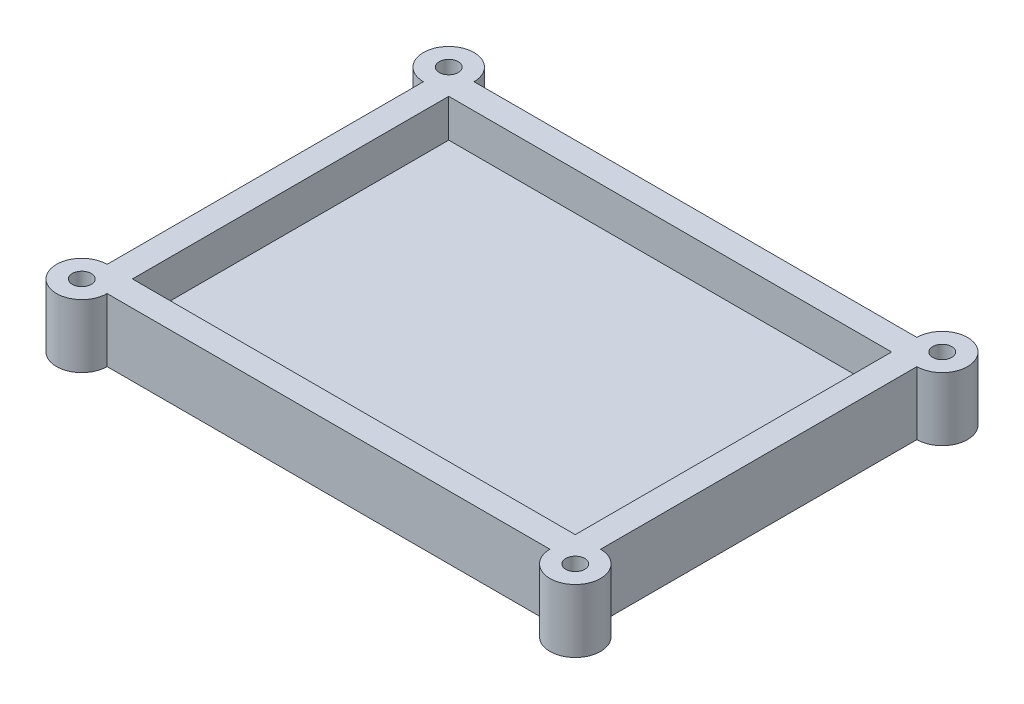
ISO-10303-21;
HEADER;
FILE_DESCRIPTION(('STEP AP214'),'2;1');
FILE_NAME('part.step','',(''),(''),'','','');
FILE_SCHEMA(('AUTOMOTIVE_DESIGN { 1 0 10303 214 1 1 1 1 }'));
ENDSEC;
DATA;
#1=APPLICATION_CONTEXT('core data for automotive mechanical design processes');
#2=APPLICATION_PROTOCOL_DEFINITION('international standard','automotive_design',2000,#1);
#3=PRODUCT_CONTEXT('',#1,'mechanical');
#4=PRODUCT('Part','Part','',(#3));
#5=PRODUCT_RELATED_PRODUCT_CATEGORY('part','',(#4));
#6=PRODUCT_DEFINITION_FORMATION('','',#4);
#7=PRODUCT_DEFINITION_CONTEXT('part definition',#1,'design');
#8=PRODUCT_DEFINITION('design','',#6,#7);
#9=PRODUCT_DEFINITION_SHAPE('','',#8);
#10=(LENGTH_UNIT() NAMED_UNIT(*) SI_UNIT(.MILLI.,.METRE.));
#11=(NAMED_UNIT(*) PLANE_ANGLE_UNIT() SI_UNIT($,.RADIAN.));
#12=(NAMED_UNIT(*) SI_UNIT($,.STERADIAN.) SOLID_ANGLE_UNIT());
#13=UNCERTAINTY_MEASURE_WITH_UNIT(LENGTH_MEASURE(1.E-05),#10,'distance_accuracy_value','');
#14=(GEOMETRIC_REPRESENTATION_CONTEXT(3) GLOBAL_UNCERTAINTY_ASSIGNED_CONTEXT((#13)) GLOBAL_UNIT_ASSIGNED_CONTEXT((#10,
#11,#12)) REPRESENTATION_CONTEXT('',''));
#15=CARTESIAN_POINT('',(0.,0.,0.));
#16=DIRECTION('',(0.,0.,1.));
#17=DIRECTION('',(1.,0.,0.));
#18=AXIS2_PLACEMENT_3D('',#15,#16,#17);
#19=CARTESIAN_POINT('',(195.,50.,-145.));
#20=DIRECTION('',(-1.,0.,0.));
#21=DIRECTION('',(0.,0.,1.));
#22=AXIS2_PLACEMENT_3D('',#19,#20,#21);
#23=PLANE('',#22);
#24=DIRECTION('',(0.,0.,-1.));
#25=VECTOR('',#24,1.);
#26=CARTESIAN_POINT('',(195.,50.,-145.));
#27=LINE('',#26,#25);
#28=CARTESIAN_POINT('',(195.,50.,125.));
#29=VERTEX_POINT('',#28);
#30=CARTESIAN_POINT('',(195.,50.,-125.));
#31=VERTEX_POINT('',#30);
#32=EDGE_CURVE('E234',#29,#31,#27,.T.);
#33=ORIENTED_EDGE('',*,*,#32,.F.);
#34=DIRECTION('',(0.,1.,0.));
#35=VECTOR('',#34,1.);
#36=CARTESIAN_POINT('',(195.,0.,125.));
#37=LINE('',#36,#35);
#38=CARTESIAN_POINT('',(195.,0.,125.));
#39=VERTEX_POINT('',#38);
#40=EDGE_CURVE('E181',#29,#39,#37,.F.);
#41=ORIENTED_EDGE('',*,*,#40,.T.);
#42=DIRECTION('',(0.,0.,-1.));
#43=VECTOR('',#42,1.);
#44=CARTESIAN_POINT('',(195.,0.,-145.));
#45=LINE('',#44,#43);
#46=CARTESIAN_POINT('',(195.,0.,-125.));
#47=VERTEX_POINT('',#46);
#48=EDGE_CURVE('E210',#39,#47,#45,.T.);
#49=ORIENTED_EDGE('',*,*,#48,.T.);
#50=DIRECTION('',(0.,1.,0.));
#51=VECTOR('',#50,1.);
#52=CARTESIAN_POINT('',(195.,0.,-125.));
#53=LINE('',#52,#51);
#54=EDGE_CURVE('E190',#47,#31,#53,.T.);
#55=ORIENTED_EDGE('',*,*,#54,.T.);
#56=EDGE_LOOP('',(#33,#41,#49,#55));
#57=FACE_BOUND('',#56,.T.);
#58=ADVANCED_FACE('F33',(#57),#23,.F.);
#59=CARTESIAN_POINT('',(-195.,50.,-145.));
#60=DIRECTION('',(0.,0.,1.));
#61=DIRECTION('',(1.,0.,0.));
#62=AXIS2_PLACEMENT_3D('',#59,#60,#61);
#63=PLANE('',#62);
#64=DIRECTION('',(-1.,0.,0.));
#65=VECTOR('',#64,1.);
#66=CARTESIAN_POINT('',(-195.,50.,-145.));
#67=LINE('',#66,#65);
#68=CARTESIAN_POINT('',(175.,50.,-145.));
#69=VERTEX_POINT('',#68);
#70=CARTESIAN_POINT('',(-175.,50.,-145.));
#71=VERTEX_POINT('',#70);
#72=EDGE_CURVE('E236',#69,#71,#67,.T.);
#73=ORIENTED_EDGE('',*,*,#72,.F.);
#74=DIRECTION('',(0.,1.,0.));
#75=VECTOR('',#74,1.);
#76=CARTESIAN_POINT('',(175.,0.,-145.));
#77=LINE('',#76,#75);
#78=CARTESIAN_POINT('',(175.,0.,-145.));
#79=VERTEX_POINT('',#78);
#80=EDGE_CURVE('E186',#69,#79,#77,.F.);
#81=ORIENTED_EDGE('',*,*,#80,.T.);
#82=DIRECTION('',(-1.,0.,0.));
#83=VECTOR('',#82,1.);
#84=CARTESIAN_POINT('',(-195.,0.,-145.));
#85=LINE('',#84,#83);
#86=CARTESIAN_POINT('',(-175.,0.,-145.));
#87=VERTEX_POINT('',#86);
#88=EDGE_CURVE('E240',#79,#87,#85,.T.);
#89=ORIENTED_EDGE('',*,*,#88,.T.);
#90=DIRECTION('',(0.,1.,0.));
#91=VECTOR('',#90,1.);
#92=CARTESIAN_POINT('',(-175.,0.,-145.));
#93=LINE('',#92,#91);
#94=EDGE_CURVE('E200',#87,#71,#93,.T.);
#95=ORIENTED_EDGE('',*,*,#94,.T.);
#96=EDGE_LOOP('',(#73,#81,#89,#95));
#97=FACE_BOUND('',#96,.T.);
#98=ADVANCED_FACE('F267',(#97),#63,.F.);
#99=CARTESIAN_POINT('',(-195.,50.,-145.));
#100=DIRECTION('',(1.,0.,0.));
#101=DIRECTION('',(0.,0.,-1.));
#102=AXIS2_PLACEMENT_3D('',#99,#100,#101);
#103=PLANE('',#102);
#104=DIRECTION('',(0.,0.,1.));
#105=VECTOR('',#104,1.);
#106=CARTESIAN_POINT('',(-195.,0.,-145.));
#107=LINE('',#106,#105);
#108=CARTESIAN_POINT('',(-195.,0.,-125.));
#109=VERTEX_POINT('',#108);
#110=CARTESIAN_POINT('',(-195.,0.,125.));
#111=VERTEX_POINT('',#110);
#112=EDGE_CURVE('E241',#109,#111,#107,.T.);
#113=ORIENTED_EDGE('',*,*,#112,.T.);
#114=DIRECTION('',(0.,1.,0.));
#115=VECTOR('',#114,1.);
#116=CARTESIAN_POINT('',(-195.,0.,125.));
#117=LINE('',#116,#115);
#118=CARTESIAN_POINT('',(-195.,50.,125.));
#119=VERTEX_POINT('',#118);
#120=EDGE_CURVE('E170',#111,#119,#117,.T.);
#121=ORIENTED_EDGE('',*,*,#120,.T.);
#122=DIRECTION('',(0.,0.,1.));
#123=VECTOR('',#122,1.);
#124=CARTESIAN_POINT('',(-195.,50.,-145.));
#125=LINE('',#124,#123);
#126=CARTESIAN_POINT('',(-195.,50.,-125.));
#127=VERTEX_POINT('',#126);
#128=EDGE_CURVE('E41',#127,#119,#125,.T.);
#129=ORIENTED_EDGE('',*,*,#128,.F.);
#130=DIRECTION('',(0.,1.,0.));
#131=VECTOR('',#130,1.);
#132=CARTESIAN_POINT('',(-195.,0.,-125.));
#133=LINE('',#132,#131);
#134=EDGE_CURVE('E196',#127,#109,#133,.F.);
#135=ORIENTED_EDGE('',*,*,#134,.T.);
#136=EDGE_LOOP('',(#113,#121,#129,#135));
#137=FACE_BOUND('',#136,.T.);
#138=ADVANCED_FACE('F277',(#137),#103,.F.);
#139=CARTESIAN_POINT('',(-195.,50.,145.));
#140=DIRECTION('',(0.,0.,-1.));
#141=DIRECTION('',(-1.,0.,0.));
#142=AXIS2_PLACEMENT_3D('',#139,#140,#141);
#143=PLANE('',#142);
#144=DIRECTION('',(1.,0.,0.));
#145=VECTOR('',#144,1.);
#146=CARTESIAN_POINT('',(-195.,50.,145.));
#147=LINE('',#146,#145);
#148=CARTESIAN_POINT('',(-175.,50.,145.));
#149=VERTEX_POINT('',#148);
#150=CARTESIAN_POINT('',(175.,50.,145.));
#151=VERTEX_POINT('',#150);
#152=EDGE_CURVE('E11',#149,#151,#147,.T.);
#153=ORIENTED_EDGE('',*,*,#152,.F.);
#154=DIRECTION('',(0.,1.,0.));
#155=VECTOR('',#154,1.);
#156=CARTESIAN_POINT('',(-175.,0.,145.));
#157=LINE('',#156,#155);
#158=CARTESIAN_POINT('',(-175.,0.,145.));
#159=VERTEX_POINT('',#158);
#160=EDGE_CURVE('E166',#149,#159,#157,.F.);
#161=ORIENTED_EDGE('',*,*,#160,.T.);
#162=DIRECTION('',(1.,0.,0.));
#163=VECTOR('',#162,1.);
#164=CARTESIAN_POINT('',(-195.,0.,145.));
#165=LINE('',#164,#163);
#166=CARTESIAN_POINT('',(175.,0.,145.));
#167=VERTEX_POINT('',#166);
#168=EDGE_CURVE('E36',#159,#167,#165,.T.);
#169=ORIENTED_EDGE('',*,*,#168,.T.);
#170=DIRECTION('',(0.,1.,0.));
#171=VECTOR('',#170,1.);
#172=CARTESIAN_POINT('',(175.,0.,145.));
#173=LINE('',#172,#171);
#174=EDGE_CURVE('E176',#167,#151,#173,.T.);
#175=ORIENTED_EDGE('',*,*,#174,.T.);
#176=EDGE_LOOP('',(#153,#161,#169,#175));
#177=FACE_BOUND('',#176,.T.);
#178=ADVANCED_FACE('F249',(#177),#143,.F.);
#179=CARTESIAN_POINT('',(0.,50.,0.));
#180=DIRECTION('',(0.,1.,0.));
#181=DIRECTION('',(0.,0.,1.));
#182=AXIS2_PLACEMENT_3D('',#179,#180,#181);
#183=PLANE('',#182);
#184=CARTESIAN_POINT('',(-195.,50.,-145.));
#185=DIRECTION('',(0.,1.,0.));
#186=DIRECTION('',(0.,0.,1.));
#187=AXIS2_PLACEMENT_3D('',#184,#185,#186);
#188=CIRCLE('',#187,7.49999999999998);
#189=CARTESIAN_POINT('',(-195.,50.,-137.5));
#190=VERTEX_POINT('',#189);
#191=EDGE_CURVE('E142',#190,#190,#188,.T.);
#192=ORIENTED_EDGE('',*,*,#191,.F.);
#193=EDGE_LOOP('',(#192));
#194=FACE_BOUND('',#193,.T.);
#195=CARTESIAN_POINT('',(195.,50.,-145.));
#196=DIRECTION('',(0.,1.,0.));
#197=DIRECTION('',(0.,0.,1.));
#198=AXIS2_PLACEMENT_3D('',#195,#196,#197);
#199=CIRCLE('',#198,7.49999999999998);
#200=CARTESIAN_POINT('',(195.,50.,-137.5));
#201=VERTEX_POINT('',#200);
#202=EDGE_CURVE('E141',#201,#201,#199,.T.);
#203=ORIENTED_EDGE('',*,*,#202,.F.);
#204=EDGE_LOOP('',(#203));
#205=FACE_BOUND('',#204,.T.);
#206=CARTESIAN_POINT('',(195.,50.,145.));
#207=DIRECTION('',(0.,1.,0.));
#208=DIRECTION('',(0.,0.,1.));
#209=AXIS2_PLACEMENT_3D('',#206,#207,#208);
#210=CIRCLE('',#209,7.49999999999998);
#211=CARTESIAN_POINT('',(195.,50.,152.5));
#212=VERTEX_POINT('',#211);
#213=EDGE_CURVE('E152',#212,#212,#210,.T.);
#214=ORIENTED_EDGE('',*,*,#213,.F.);
#215=EDGE_LOOP('',(#214));
#216=FACE_BOUND('',#215,.T.);
#217=CARTESIAN_POINT('',(-195.,50.,145.));
#218=DIRECTION('',(0.,1.,0.));
#219=DIRECTION('',(0.,0.,1.));
#220=AXIS2_PLACEMENT_3D('',#217,#218,#219);
#221=CIRCLE('',#220,7.49999999999998);
#222=CARTESIAN_POINT('',(-195.,50.,152.5));
#223=VERTEX_POINT('',#222);
#224=EDGE_CURVE('E158',#223,#223,#221,.T.);
#225=ORIENTED_EDGE('',*,*,#224,.F.);
#226=EDGE_LOOP('',(#225));
#227=FACE_BOUND('',#226,.T.);
#228=ORIENTED_EDGE('',*,*,#128,.T.);
#229=CARTESIAN_POINT('',(-195.,50.,145.));
#230=DIRECTION('',(0.,1.,0.));
#231=DIRECTION('',(0.,0.,-1.));
#232=AXIS2_PLACEMENT_3D('',#229,#230,#231);
#233=CIRCLE('',#232,20.);
#234=EDGE_CURVE('E48',#119,#149,#233,.T.);
#235=ORIENTED_EDGE('',*,*,#234,.T.);
#236=ORIENTED_EDGE('',*,*,#152,.T.);
#237=CARTESIAN_POINT('',(195.,50.,145.));
#238=DIRECTION('',(0.,1.,0.));
#239=DIRECTION('',(0.,0.,1.));
#240=AXIS2_PLACEMENT_3D('',#237,#238,#239);
#241=CIRCLE('',#240,20.);
#242=EDGE_CURVE('E173',#151,#29,#241,.T.);
#243=ORIENTED_EDGE('',*,*,#242,.T.);
#244=ORIENTED_EDGE('',*,*,#32,.T.);
#245=CARTESIAN_POINT('',(195.,50.,-145.));
#246=DIRECTION('',(0.,1.,0.));
#247=DIRECTION('',(0.,0.,-1.));
#248=AXIS2_PLACEMENT_3D('',#245,#246,#247);
#249=CIRCLE('',#248,20.);
#250=EDGE_CURVE('E55',#31,#69,#249,.T.);
#251=ORIENTED_EDGE('',*,*,#250,.T.);
#252=ORIENTED_EDGE('',*,*,#72,.T.);
#253=CARTESIAN_POINT('',(-195.,50.,-145.));
#254=DIRECTION('',(0.,1.,0.));
#255=DIRECTION('',(0.,0.,1.));
#256=AXIS2_PLACEMENT_3D('',#253,#254,#255);
#257=CIRCLE('',#256,20.);
#258=EDGE_CURVE('E193',#71,#127,#257,.T.);
#259=ORIENTED_EDGE('',*,*,#258,.T.);
#260=EDGE_LOOP('',(#228,#235,#236,#243,#244,#251,#252,#259));
#261=FACE_BOUND('',#260,.T.);
#262=DIRECTION('',(0.,0.,-1.));
#263=VECTOR('',#262,1.);
#264=CARTESIAN_POINT('',(175.,50.,-145.));
#265=LINE('',#264,#263);
#266=CARTESIAN_POINT('',(175.,50.,125.));
#267=VERTEX_POINT('',#266);
#268=CARTESIAN_POINT('',(175.,50.,-125.));
#269=VERTEX_POINT('',#268);
#270=EDGE_CURVE('E226',#267,#269,#265,.T.);
#271=ORIENTED_EDGE('',*,*,#270,.F.);
#272=DIRECTION('',(1.,0.,0.));
#273=VECTOR('',#272,1.);
#274=CARTESIAN_POINT('',(-195.,50.,125.));
#275=LINE('',#274,#273);
#276=CARTESIAN_POINT('',(-175.,50.,125.));
#277=VERTEX_POINT('',#276);
#278=EDGE_CURVE('E216',#277,#267,#275,.T.);
#279=ORIENTED_EDGE('',*,*,#278,.F.);
#280=DIRECTION('',(0.,0.,1.));
#281=VECTOR('',#280,1.);
#282=CARTESIAN_POINT('',(-175.,50.,-145.));
#283=LINE('',#282,#281);
#284=CARTESIAN_POINT('',(-175.,50.,-125.));
#285=VERTEX_POINT('',#284);
#286=EDGE_CURVE('E230',#285,#277,#283,.T.);
#287=ORIENTED_EDGE('',*,*,#286,.F.);
#288=DIRECTION('',(-1.,0.,0.));
#289=VECTOR('',#288,1.);
#290=CARTESIAN_POINT('',(-195.,50.,-125.));
#291=LINE('',#290,#289);
#292=EDGE_CURVE('E228',#269,#285,#291,.T.);
#293=ORIENTED_EDGE('',*,*,#292,.F.);
#294=EDGE_LOOP('',(#271,#279,#287,#293));
#295=FACE_BOUND('',#294,.T.);
#296=ADVANCED_FACE('F270',(#194,#205,#216,#227,#261,#295),#183,.T.);
#297=CARTESIAN_POINT('',(0.,0.,0.));
#298=DIRECTION('',(0.,1.,0.));
#299=DIRECTION('',(0.,0.,1.));
#300=AXIS2_PLACEMENT_3D('',#297,#298,#299);
#301=PLANE('',#300);
#302=ORIENTED_EDGE('',*,*,#168,.F.);
#303=CARTESIAN_POINT('',(-195.,0.,145.));
#304=DIRECTION('',(0.,1.,0.));
#305=DIRECTION('',(0.,0.,-1.));
#306=AXIS2_PLACEMENT_3D('',#303,#304,#305);
#307=CIRCLE('',#306,20.);
#308=EDGE_CURVE('E164',#111,#159,#307,.T.);
#309=ORIENTED_EDGE('',*,*,#308,.F.);
#310=ORIENTED_EDGE('',*,*,#112,.F.);
#311=CARTESIAN_POINT('',(-195.,0.,-145.));
#312=DIRECTION('',(0.,1.,0.));
#313=DIRECTION('',(0.,0.,1.));
#314=AXIS2_PLACEMENT_3D('',#311,#312,#313);
#315=CIRCLE('',#314,20.);
#316=EDGE_CURVE('E194',#87,#109,#315,.T.);
#317=ORIENTED_EDGE('',*,*,#316,.F.);
#318=ORIENTED_EDGE('',*,*,#88,.F.);
#319=CARTESIAN_POINT('',(195.,0.,-145.));
#320=DIRECTION('',(0.,1.,0.));
#321=DIRECTION('',(0.,0.,-1.));
#322=AXIS2_PLACEMENT_3D('',#319,#320,#321);
#323=CIRCLE('',#322,20.);
#324=EDGE_CURVE('E184',#47,#79,#323,.T.);
#325=ORIENTED_EDGE('',*,*,#324,.F.);
#326=ORIENTED_EDGE('',*,*,#48,.F.);
#327=CARTESIAN_POINT('',(195.,0.,145.));
#328=DIRECTION('',(0.,1.,0.));
#329=DIRECTION('',(0.,0.,1.));
#330=AXIS2_PLACEMENT_3D('',#327,#328,#329);
#331=CIRCLE('',#330,20.);
#332=EDGE_CURVE('E174',#167,#39,#331,.T.);
#333=ORIENTED_EDGE('',*,*,#332,.F.);
#334=EDGE_LOOP('',(#302,#309,#310,#317,#318,#325,#326,#333));
#335=FACE_BOUND('',#334,.T.);
#336=ADVANCED_FACE('F257',(#335),#301,.F.);
#337=CARTESIAN_POINT('',(175.,50.,-145.));
#338=DIRECTION('',(-1.,0.,0.));
#339=DIRECTION('',(0.,0.,1.));
#340=AXIS2_PLACEMENT_3D('',#337,#338,#339);
#341=PLANE('',#340);
#342=DIRECTION('',(0.,0.,-1.));
#343=VECTOR('',#342,1.);
#344=CARTESIAN_POINT('',(175.,20.,-145.));
#345=LINE('',#344,#343);
#346=CARTESIAN_POINT('',(175.,20.,125.));
#347=VERTEX_POINT('',#346);
#348=CARTESIAN_POINT('',(175.,20.,-125.));
#349=VERTEX_POINT('',#348);
#350=EDGE_CURVE('E203',#347,#349,#345,.T.);
#351=ORIENTED_EDGE('',*,*,#350,.F.);
#352=DIRECTION('',(0.,-1.,0.));
#353=VECTOR('',#352,1.);
#354=CARTESIAN_POINT('',(175.,50.,125.));
#355=LINE('',#354,#353);
#356=EDGE_CURVE('E212',#267,#347,#355,.T.);
#357=ORIENTED_EDGE('',*,*,#356,.F.);
#358=ORIENTED_EDGE('',*,*,#270,.T.);
#359=DIRECTION('',(0.,-1.,0.));
#360=VECTOR('',#359,1.);
#361=CARTESIAN_POINT('',(175.,50.,-125.));
#362=LINE('',#361,#360);
#363=EDGE_CURVE('E207',#269,#349,#362,.T.);
#364=ORIENTED_EDGE('',*,*,#363,.T.);
#365=EDGE_LOOP('',(#351,#357,#358,#364));
#366=FACE_BOUND('',#365,.T.);
#367=ADVANCED_FACE('F304',(#366),#341,.T.);
#368=CARTESIAN_POINT('',(-195.,50.,-125.));
#369=DIRECTION('',(0.,0.,1.));
#370=DIRECTION('',(1.,0.,0.));
#371=AXIS2_PLACEMENT_3D('',#368,#369,#370);
#372=PLANE('',#371);
#373=DIRECTION('',(-1.,0.,0.));
#374=VECTOR('',#373,1.);
#375=CARTESIAN_POINT('',(-195.,20.,-125.));
#376=LINE('',#375,#374);
#377=CARTESIAN_POINT('',(-175.,20.,-125.));
#378=VERTEX_POINT('',#377);
#379=EDGE_CURVE('E206',#349,#378,#376,.T.);
#380=ORIENTED_EDGE('',*,*,#379,.F.);
#381=ORIENTED_EDGE('',*,*,#363,.F.);
#382=ORIENTED_EDGE('',*,*,#292,.T.);
#383=DIRECTION('',(0.,-1.,0.));
#384=VECTOR('',#383,1.);
#385=CARTESIAN_POINT('',(-175.,50.,-125.));
#386=LINE('',#385,#384);
#387=EDGE_CURVE('E211',#285,#378,#386,.T.);
#388=ORIENTED_EDGE('',*,*,#387,.T.);
#389=EDGE_LOOP('',(#380,#381,#382,#388));
#390=FACE_BOUND('',#389,.T.);
#391=ADVANCED_FACE('F319',(#390),#372,.T.);
#392=CARTESIAN_POINT('',(-175.,50.,-145.));
#393=DIRECTION('',(1.,0.,0.));
#394=DIRECTION('',(0.,0.,-1.));
#395=AXIS2_PLACEMENT_3D('',#392,#393,#394);
#396=PLANE('',#395);
#397=DIRECTION('',(0.,0.,1.));
#398=VECTOR('',#397,1.);
#399=CARTESIAN_POINT('',(-175.,20.,-145.));
#400=LINE('',#399,#398);
#401=CARTESIAN_POINT('',(-175.,20.,125.));
#402=VERTEX_POINT('',#401);
#403=EDGE_CURVE('E218',#378,#402,#400,.T.);
#404=ORIENTED_EDGE('',*,*,#403,.F.);
#405=ORIENTED_EDGE('',*,*,#387,.F.);
#406=ORIENTED_EDGE('',*,*,#286,.T.);
#407=DIRECTION('',(0.,-1.,0.));
#408=VECTOR('',#407,1.);
#409=CARTESIAN_POINT('',(-175.,50.,125.));
#410=LINE('',#409,#408);
#411=EDGE_CURVE('E215',#277,#402,#410,.T.);
#412=ORIENTED_EDGE('',*,*,#411,.T.);
#413=EDGE_LOOP('',(#404,#405,#406,#412));
#414=FACE_BOUND('',#413,.T.);
#415=ADVANCED_FACE('F315',(#414),#396,.T.);
#416=CARTESIAN_POINT('',(-195.,50.,125.));
#417=DIRECTION('',(0.,0.,-1.));
#418=DIRECTION('',(-1.,0.,0.));
#419=AXIS2_PLACEMENT_3D('',#416,#417,#418);
#420=PLANE('',#419);
#421=DIRECTION('',(1.,0.,0.));
#422=VECTOR('',#421,1.);
#423=CARTESIAN_POINT('',(-195.,20.,125.));
#424=LINE('',#423,#422);
#425=EDGE_CURVE('E222',#402,#347,#424,.T.);
#426=ORIENTED_EDGE('',*,*,#425,.F.);
#427=ORIENTED_EDGE('',*,*,#411,.F.);
#428=ORIENTED_EDGE('',*,*,#278,.T.);
#429=ORIENTED_EDGE('',*,*,#356,.T.);
#430=EDGE_LOOP('',(#426,#427,#428,#429));
#431=FACE_BOUND('',#430,.T.);
#432=ADVANCED_FACE('F311',(#431),#420,.T.);
#433=CARTESIAN_POINT('',(0.,20.,0.));
#434=DIRECTION('',(0.,1.,0.));
#435=DIRECTION('',(0.,0.,1.));
#436=AXIS2_PLACEMENT_3D('',#433,#434,#435);
#437=PLANE('',#436);
#438=ORIENTED_EDGE('',*,*,#350,.T.);
#439=ORIENTED_EDGE('',*,*,#379,.T.);
#440=ORIENTED_EDGE('',*,*,#403,.T.);
#441=ORIENTED_EDGE('',*,*,#425,.T.);
#442=EDGE_LOOP('',(#438,#439,#440,#441));
#443=FACE_BOUND('',#442,.T.);
#444=ADVANCED_FACE('F308',(#443),#437,.T.);
#445=CARTESIAN_POINT('',(-195.,0.,-145.));
#446=DIRECTION('',(0.,1.,0.));
#447=DIRECTION('',(0.,0.,1.));
#448=AXIS2_PLACEMENT_3D('',#445,#446,#447);
#449=CYLINDRICAL_SURFACE('',#448,20.);
#450=ORIENTED_EDGE('',*,*,#94,.F.);
#451=ORIENTED_EDGE('',*,*,#316,.T.);
#452=ORIENTED_EDGE('',*,*,#134,.F.);
#453=ORIENTED_EDGE('',*,*,#258,.F.);
#454=EDGE_LOOP('',(#450,#451,#452,#453));
#455=FACE_BOUND('',#454,.T.);
#456=ADVANCED_FACE('F274',(#455),#449,.T.);
#457=CARTESIAN_POINT('',(195.,0.,-145.));
#458=DIRECTION('',(0.,1.,0.));
#459=DIRECTION('',(0.,0.,1.));
#460=AXIS2_PLACEMENT_3D('',#457,#458,#459);
#461=CYLINDRICAL_SURFACE('',#460,20.);
#462=ORIENTED_EDGE('',*,*,#54,.F.);
#463=ORIENTED_EDGE('',*,*,#324,.T.);
#464=ORIENTED_EDGE('',*,*,#80,.F.);
#465=ORIENTED_EDGE('',*,*,#250,.F.);
#466=EDGE_LOOP('',(#462,#463,#464,#465));
#467=FACE_BOUND('',#466,.T.);
#468=ADVANCED_FACE('F264',(#467),#461,.T.);
#469=CARTESIAN_POINT('',(195.,0.,145.));
#470=DIRECTION('',(0.,1.,0.));
#471=DIRECTION('',(0.,0.,1.));
#472=AXIS2_PLACEMENT_3D('',#469,#470,#471);
#473=CYLINDRICAL_SURFACE('',#472,20.);
#474=ORIENTED_EDGE('',*,*,#40,.F.);
#475=ORIENTED_EDGE('',*,*,#242,.F.);
#476=ORIENTED_EDGE('',*,*,#174,.F.);
#477=ORIENTED_EDGE('',*,*,#332,.T.);
#478=EDGE_LOOP('',(#474,#475,#476,#477));
#479=FACE_BOUND('',#478,.T.);
#480=ADVANCED_FACE('F255',(#479),#473,.T.);
#481=CARTESIAN_POINT('',(-195.,0.,145.));
#482=DIRECTION('',(0.,1.,0.));
#483=DIRECTION('',(0.,0.,1.));
#484=AXIS2_PLACEMENT_3D('',#481,#482,#483);
#485=CYLINDRICAL_SURFACE('',#484,20.);
#486=ORIENTED_EDGE('',*,*,#120,.F.);
#487=ORIENTED_EDGE('',*,*,#308,.T.);
#488=ORIENTED_EDGE('',*,*,#160,.F.);
#489=ORIENTED_EDGE('',*,*,#234,.F.);
#490=EDGE_LOOP('',(#486,#487,#488,#489));
#491=FACE_BOUND('',#490,.T.);
#492=ADVANCED_FACE('F279',(#491),#485,.T.);
#493=CARTESIAN_POINT('',(-195.,30.,145.));
#494=DIRECTION('',(0.,1.,0.));
#495=DIRECTION('',(0.,0.,1.));
#496=AXIS2_PLACEMENT_3D('',#493,#494,#495);
#497=CONICAL_SURFACE('',#496,7.49999999999998,1.02974425867665);
#498=CARTESIAN_POINT('',(-195.,25.4935453572933,145.));
#499=VERTEX_POINT('',#498);
#500=VERTEX_LOOP('',#499);
#501=FACE_BOUND('',#500,.T.);
#502=CARTESIAN_POINT('',(-195.,30.,145.));
#503=DIRECTION('',(0.,1.,0.));
#504=DIRECTION('',(0.,0.,1.));
#505=AXIS2_PLACEMENT_3D('',#502,#503,#504);
#506=CIRCLE('',#505,7.49999999999998);
#507=CARTESIAN_POINT('',(-195.,30.,152.5));
#508=VERTEX_POINT('',#507);
#509=EDGE_CURVE('E161',#508,#508,#506,.T.);
#510=ORIENTED_EDGE('',*,*,#509,.T.);
#511=EDGE_LOOP('',(#510));
#512=FACE_BOUND('',#511,.T.);
#513=ADVANCED_FACE('F281',(#501,#512),#497,.F.);
#514=CARTESIAN_POINT('',(-195.,50.,145.));
#515=DIRECTION('',(0.,1.,0.));
#516=DIRECTION('',(0.,0.,1.));
#517=AXIS2_PLACEMENT_3D('',#514,#515,#516);
#518=CYLINDRICAL_SURFACE('',#517,7.49999999999998);
#519=ORIENTED_EDGE('',*,*,#509,.F.);
#520=EDGE_LOOP('',(#519));
#521=FACE_BOUND('',#520,.T.);
#522=ORIENTED_EDGE('',*,*,#224,.T.);
#523=EDGE_LOOP('',(#522));
#524=FACE_BOUND('',#523,.T.);
#525=ADVANCED_FACE('F287',(#521,#524),#518,.F.);
#526=CARTESIAN_POINT('',(195.,30.,145.));
#527=DIRECTION('',(0.,1.,0.));
#528=DIRECTION('',(0.,0.,1.));
#529=AXIS2_PLACEMENT_3D('',#526,#527,#528);
#530=CONICAL_SURFACE('',#529,7.49999999999998,1.02974425867665);
#531=CARTESIAN_POINT('',(195.,25.4935453572933,145.));
#532=VERTEX_POINT('',#531);
#533=VERTEX_LOOP('',#532);
#534=FACE_BOUND('',#533,.T.);
#535=CARTESIAN_POINT('',(195.,30.,145.));
#536=DIRECTION('',(0.,1.,0.));
#537=DIRECTION('',(0.,0.,1.));
#538=AXIS2_PLACEMENT_3D('',#535,#536,#537);
#539=CIRCLE('',#538,7.49999999999998);
#540=CARTESIAN_POINT('',(195.,30.,152.5));
#541=VERTEX_POINT('',#540);
#542=EDGE_CURVE('E155',#541,#541,#539,.T.);
#543=ORIENTED_EDGE('',*,*,#542,.T.);
#544=EDGE_LOOP('',(#543));
#545=FACE_BOUND('',#544,.T.);
#546=ADVANCED_FACE('F365',(#534,#545),#530,.F.);
#547=CARTESIAN_POINT('',(195.,50.,145.));
#548=DIRECTION('',(0.,1.,0.));
#549=DIRECTION('',(0.,0.,1.));
#550=AXIS2_PLACEMENT_3D('',#547,#548,#549);
#551=CYLINDRICAL_SURFACE('',#550,7.49999999999998);
#552=ORIENTED_EDGE('',*,*,#542,.F.);
#553=EDGE_LOOP('',(#552));
#554=FACE_BOUND('',#553,.T.);
#555=ORIENTED_EDGE('',*,*,#213,.T.);
#556=EDGE_LOOP('',(#555));
#557=FACE_BOUND('',#556,.T.);
#558=ADVANCED_FACE('F375',(#554,#557),#551,.F.);
#559=CARTESIAN_POINT('',(195.,30.,-145.));
#560=DIRECTION('',(0.,1.,0.));
#561=DIRECTION('',(0.,0.,1.));
#562=AXIS2_PLACEMENT_3D('',#559,#560,#561);
#563=CONICAL_SURFACE('',#562,7.49999999999998,1.02974425867665);
#564=CARTESIAN_POINT('',(195.,25.4935453572933,-145.));
#565=VERTEX_POINT('',#564);
#566=VERTEX_LOOP('',#565);
#567=FACE_BOUND('',#566,.T.);
#568=CARTESIAN_POINT('',(195.,30.,-145.));
#569=DIRECTION('',(0.,1.,0.));
#570=DIRECTION('',(0.,0.,1.));
#571=AXIS2_PLACEMENT_3D('',#568,#569,#570);
#572=CIRCLE('',#571,7.49999999999998);
#573=CARTESIAN_POINT('',(195.,30.,-137.5));
#574=VERTEX_POINT('',#573);
#575=EDGE_CURVE('E145',#574,#574,#572,.T.);
#576=ORIENTED_EDGE('',*,*,#575,.T.);
#577=EDGE_LOOP('',(#576));
#578=FACE_BOUND('',#577,.T.);
#579=ADVANCED_FACE('F385',(#567,#578),#563,.F.);
#580=CARTESIAN_POINT('',(195.,50.,-145.));
#581=DIRECTION('',(0.,1.,0.));
#582=DIRECTION('',(0.,0.,1.));
#583=AXIS2_PLACEMENT_3D('',#580,#581,#582);
#584=CYLINDRICAL_SURFACE('',#583,7.49999999999998);
#585=ORIENTED_EDGE('',*,*,#575,.F.);
#586=EDGE_LOOP('',(#585));
#587=FACE_BOUND('',#586,.T.);
#588=ORIENTED_EDGE('',*,*,#202,.T.);
#589=EDGE_LOOP('',(#588));
#590=FACE_BOUND('',#589,.T.);
#591=ADVANCED_FACE('F135',(#587,#590),#584,.F.);
#592=CARTESIAN_POINT('',(-195.,30.,-145.));
#593=DIRECTION('',(0.,1.,0.));
#594=DIRECTION('',(0.,0.,1.));
#595=AXIS2_PLACEMENT_3D('',#592,#593,#594);
#596=CONICAL_SURFACE('',#595,7.49999999999998,1.02974425867665);
#597=CARTESIAN_POINT('',(-195.,25.4935453572933,-145.));
#598=VERTEX_POINT('',#597);
#599=VERTEX_LOOP('',#598);
#600=FACE_BOUND('',#599,.T.);
#601=CARTESIAN_POINT('',(-195.,30.,-145.));
#602=DIRECTION('',(0.,1.,0.));
#603=DIRECTION('',(0.,0.,1.));
#604=AXIS2_PLACEMENT_3D('',#601,#602,#603);
#605=CIRCLE('',#604,7.49999999999998);
#606=CARTESIAN_POINT('',(-195.,30.,-137.5));
#607=VERTEX_POINT('',#606);
#608=EDGE_CURVE('E139',#607,#607,#605,.T.);
#609=ORIENTED_EDGE('',*,*,#608,.T.);
#610=EDGE_LOOP('',(#609));
#611=FACE_BOUND('',#610,.T.);
#612=ADVANCED_FACE('F131',(#600,#611),#596,.F.);
#613=CARTESIAN_POINT('',(-195.,50.,-145.));
#614=DIRECTION('',(0.,1.,0.));
#615=DIRECTION('',(0.,0.,1.));
#616=AXIS2_PLACEMENT_3D('',#613,#614,#615);
#617=CYLINDRICAL_SURFACE('',#616,7.49999999999998);
#618=ORIENTED_EDGE('',*,*,#608,.F.);
#619=EDGE_LOOP('',(#618));
#620=FACE_BOUND('',#619,.T.);
#621=ORIENTED_EDGE('',*,*,#191,.T.);
#622=EDGE_LOOP('',(#621));
#623=FACE_BOUND('',#622,.T.);
#624=ADVANCED_FACE('F134',(#620,#623),#617,.F.);
#625=CLOSED_SHELL('',(#58,#98,#138,#178,#296,#336,#367,#391,#415,#432,#444,#456,#468,#480,#492,
#513,#525,#546,#558,#579,#591,#612,#624));
#626=MANIFOLD_SOLID_BREP('B2',#625);
#627=ADVANCED_BREP_SHAPE_REPRESENTATION('',(#18,#626),#14);
#628=SHAPE_DEFINITION_REPRESENTATION(#9,#627);
ENDSEC;
END-ISO-10303-21;
